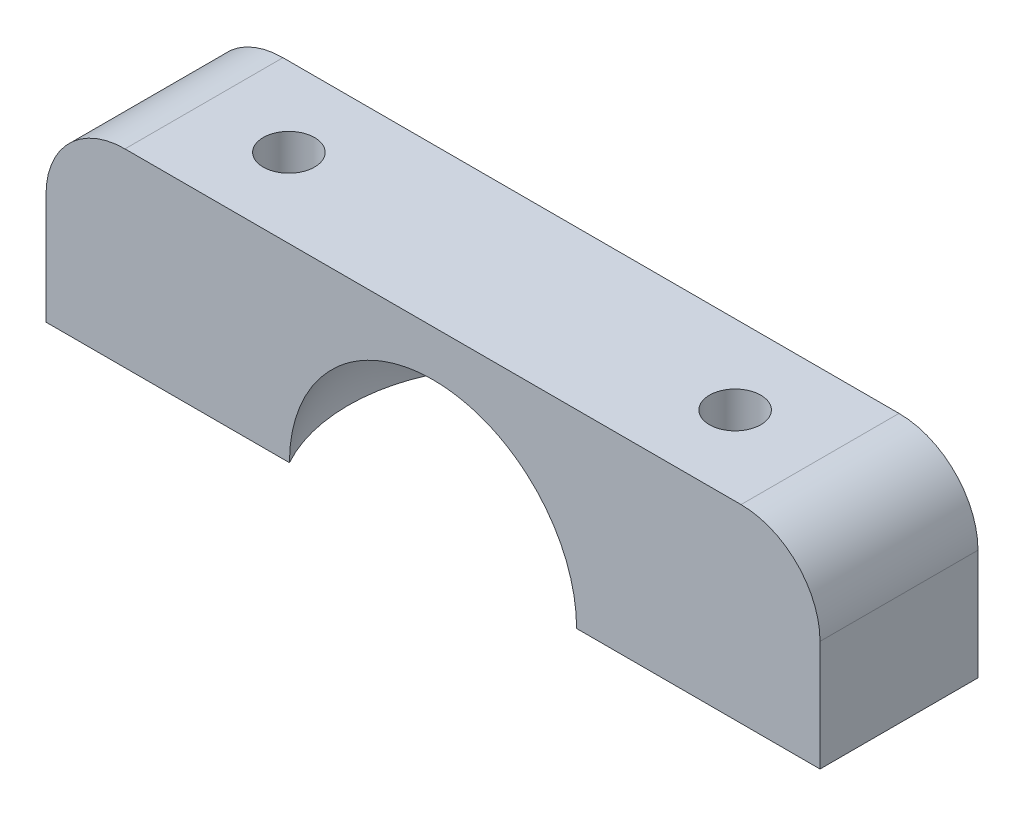
ISO-10303-21;
HEADER;
FILE_DESCRIPTION(('STEP AP214'),'2;1');
FILE_NAME('part.step','',(''),(''),'','','');
FILE_SCHEMA(('AUTOMOTIVE_DESIGN { 1 0 10303 214 1 1 1 1 }'));
ENDSEC;
DATA;
#1=APPLICATION_CONTEXT('core data for automotive mechanical design processes');
#2=APPLICATION_PROTOCOL_DEFINITION('international standard','automotive_design',2000,#1);
#3=PRODUCT_CONTEXT('',#1,'mechanical');
#4=PRODUCT('Part','Part','',(#3));
#5=PRODUCT_RELATED_PRODUCT_CATEGORY('part','',(#4));
#6=PRODUCT_DEFINITION_FORMATION('','',#4);
#7=PRODUCT_DEFINITION_CONTEXT('part definition',#1,'design');
#8=PRODUCT_DEFINITION('design','',#6,#7);
#9=PRODUCT_DEFINITION_SHAPE('','',#8);
#10=(LENGTH_UNIT() NAMED_UNIT(*) SI_UNIT(.MILLI.,.METRE.));
#11=(NAMED_UNIT(*) PLANE_ANGLE_UNIT() SI_UNIT($,.RADIAN.));
#12=(NAMED_UNIT(*) SI_UNIT($,.STERADIAN.) SOLID_ANGLE_UNIT());
#13=UNCERTAINTY_MEASURE_WITH_UNIT(LENGTH_MEASURE(1.E-05),#10,'distance_accuracy_value','');
#14=(GEOMETRIC_REPRESENTATION_CONTEXT(3) GLOBAL_UNCERTAINTY_ASSIGNED_CONTEXT((#13)) GLOBAL_UNIT_ASSIGNED_CONTEXT((#10,
#11,#12)) REPRESENTATION_CONTEXT('',''));
#15=CARTESIAN_POINT('',(0.,0.,0.));
#16=DIRECTION('',(0.,0.,1.));
#17=DIRECTION('',(1.,0.,0.));
#18=AXIS2_PLACEMENT_3D('',#15,#16,#17);
#19=CARTESIAN_POINT('',(-9.8,-4.8,2.));
#20=DIRECTION('',(0.,1.,0.));
#21=DIRECTION('',(-1.,0.,0.));
#22=AXIS2_PLACEMENT_3D('',#19,#20,#21);
#23=PLANE('',#22);
#24=CARTESIAN_POINT('',(5.65,-4.8,0.));
#25=DIRECTION('',(0.,1.,0.));
#26=DIRECTION('',(-1.,0.,0.));
#27=AXIS2_PLACEMENT_3D('',#24,#25,#26);
#28=CIRCLE('',#27,0.650000000000013);
#29=CARTESIAN_POINT('',(4.99999999999999,-4.8,0.));
#30=VERTEX_POINT('',#29);
#31=EDGE_CURVE('E134',#30,#30,#28,.T.);
#32=ORIENTED_EDGE('',*,*,#31,.T.);
#33=EDGE_LOOP('',(#32));
#34=FACE_BOUND('',#33,.T.);
#35=DIRECTION('',(1.,0.,0.));
#36=VECTOR('',#35,1.);
#37=CARTESIAN_POINT('',(-9.8,-4.8,2.));
#38=LINE('',#37,#36);
#39=CARTESIAN_POINT('',(3.63627556711534,-4.8,2.));
#40=VERTEX_POINT('',#39);
#41=CARTESIAN_POINT('',(9.8,-4.8,2.));
#42=VERTEX_POINT('',#41);
#43=EDGE_CURVE('E124',#40,#42,#38,.T.);
#44=ORIENTED_EDGE('',*,*,#43,.F.);
#45=CARTESIAN_POINT('',(0.,-4.8,0.));
#46=DIRECTION('',(0.,1.,0.));
#47=DIRECTION('',(-1.,0.,0.));
#48=AXIS2_PLACEMENT_3D('',#45,#46,#47);
#49=CIRCLE('',#48,4.15);
#50=CARTESIAN_POINT('',(3.63627556711534,-4.8,-2.));
#51=VERTEX_POINT('',#50);
#52=EDGE_CURVE('E108',#40,#51,#49,.T.);
#53=ORIENTED_EDGE('',*,*,#52,.T.);
#54=DIRECTION('',(1.,0.,0.));
#55=VECTOR('',#54,1.);
#56=CARTESIAN_POINT('',(-9.8,-4.8,-2.));
#57=LINE('',#56,#55);
#58=CARTESIAN_POINT('',(9.8,-4.8,-2.));
#59=VERTEX_POINT('',#58);
#60=EDGE_CURVE('E122',#51,#59,#57,.T.);
#61=ORIENTED_EDGE('',*,*,#60,.T.);
#62=DIRECTION('',(0.,0.,-1.));
#63=VECTOR('',#62,1.);
#64=CARTESIAN_POINT('',(9.8,-4.8,2.));
#65=LINE('',#64,#63);
#66=EDGE_CURVE('E142',#42,#59,#65,.T.);
#67=ORIENTED_EDGE('',*,*,#66,.F.);
#68=EDGE_LOOP('',(#44,#53,#61,#67));
#69=FACE_BOUND('',#68,.T.);
#70=ADVANCED_FACE('F39',(#34,#69),#23,.F.);
#71=CARTESIAN_POINT('',(9.8,0.,2.));
#72=DIRECTION('',(0.,-1.,0.));
#73=DIRECTION('',(1.,0.,0.));
#74=AXIS2_PLACEMENT_3D('',#71,#72,#73);
#75=PLANE('',#74);
#76=CARTESIAN_POINT('',(-5.65,0.,0.));
#77=DIRECTION('',(0.,1.,0.));
#78=DIRECTION('',(0.,0.,1.));
#79=AXIS2_PLACEMENT_3D('',#76,#77,#78);
#80=CIRCLE('',#79,0.650000000000013);
#81=CARTESIAN_POINT('',(-5.65,0.,0.650000000000013));
#82=VERTEX_POINT('',#81);
#83=EDGE_CURVE('E191',#82,#82,#80,.T.);
#84=ORIENTED_EDGE('',*,*,#83,.F.);
#85=EDGE_LOOP('',(#84));
#86=FACE_BOUND('',#85,.T.);
#87=DIRECTION('',(-1.,0.,0.));
#88=VECTOR('',#87,1.);
#89=CARTESIAN_POINT('',(9.8,0.,-2.));
#90=LINE('',#89,#88);
#91=CARTESIAN_POINT('',(7.8,0.,-2.));
#92=VERTEX_POINT('',#91);
#93=CARTESIAN_POINT('',(-7.8,0.,-2.));
#94=VERTEX_POINT('',#93);
#95=EDGE_CURVE('E139',#92,#94,#90,.T.);
#96=ORIENTED_EDGE('',*,*,#95,.T.);
#97=DIRECTION('',(0.,0.,-1.));
#98=VECTOR('',#97,1.);
#99=CARTESIAN_POINT('',(-7.8,0.,2.));
#100=LINE('',#99,#98);
#101=CARTESIAN_POINT('',(-7.8,0.,2.));
#102=VERTEX_POINT('',#101);
#103=EDGE_CURVE('E60',#94,#102,#100,.F.);
#104=ORIENTED_EDGE('',*,*,#103,.T.);
#105=DIRECTION('',(-1.,0.,0.));
#106=VECTOR('',#105,1.);
#107=CARTESIAN_POINT('',(-3.46410161513775,0.,2.));
#108=LINE('',#107,#106);
#109=CARTESIAN_POINT('',(7.8,0.,2.));
#110=VERTEX_POINT('',#109);
#111=EDGE_CURVE('E141',#110,#102,#108,.T.);
#112=ORIENTED_EDGE('',*,*,#111,.F.);
#113=DIRECTION('',(0.,0.,-1.));
#114=VECTOR('',#113,1.);
#115=CARTESIAN_POINT('',(7.8,0.,2.));
#116=LINE('',#115,#114);
#117=EDGE_CURVE('E153',#110,#92,#116,.T.);
#118=ORIENTED_EDGE('',*,*,#117,.T.);
#119=EDGE_LOOP('',(#96,#104,#112,#118));
#120=FACE_BOUND('',#119,.T.);
#121=CARTESIAN_POINT('',(5.65,0.,0.));
#122=DIRECTION('',(0.,1.,0.));
#123=DIRECTION('',(0.,0.,1.));
#124=AXIS2_PLACEMENT_3D('',#121,#122,#123);
#125=CIRCLE('',#124,0.650000000000013);
#126=CARTESIAN_POINT('',(5.65,0.,0.650000000000013));
#127=VERTEX_POINT('',#126);
#128=EDGE_CURVE('E185',#127,#127,#125,.T.);
#129=ORIENTED_EDGE('',*,*,#128,.F.);
#130=EDGE_LOOP('',(#129));
#131=FACE_BOUND('',#130,.T.);
#132=ADVANCED_FACE('F173',(#86,#120,#131),#75,.F.);
#133=CARTESIAN_POINT('',(-9.8,0.,2.));
#134=DIRECTION('',(1.,0.,0.));
#135=DIRECTION('',(0.,0.,-1.));
#136=AXIS2_PLACEMENT_3D('',#133,#134,#135);
#137=PLANE('',#136);
#138=DIRECTION('',(0.,-1.,0.));
#139=VECTOR('',#138,1.);
#140=CARTESIAN_POINT('',(-9.8,0.,2.));
#141=LINE('',#140,#139);
#142=CARTESIAN_POINT('',(-9.8,-2.00000000000001,2.));
#143=VERTEX_POINT('',#142);
#144=CARTESIAN_POINT('',(-9.8,-4.8,2.));
#145=VERTEX_POINT('',#144);
#146=EDGE_CURVE('E163',#143,#145,#141,.T.);
#147=ORIENTED_EDGE('',*,*,#146,.F.);
#148=DIRECTION('',(0.,0.,-1.));
#149=VECTOR('',#148,1.);
#150=CARTESIAN_POINT('',(-9.8,-2.00000000000001,2.));
#151=LINE('',#150,#149);
#152=CARTESIAN_POINT('',(-9.8,-2.00000000000001,-2.));
#153=VERTEX_POINT('',#152);
#154=EDGE_CURVE('E116',#143,#153,#151,.T.);
#155=ORIENTED_EDGE('',*,*,#154,.T.);
#156=DIRECTION('',(0.,-1.,0.));
#157=VECTOR('',#156,1.);
#158=CARTESIAN_POINT('',(-9.8,0.,-2.));
#159=LINE('',#158,#157);
#160=CARTESIAN_POINT('',(-9.8,-4.8,-2.));
#161=VERTEX_POINT('',#160);
#162=EDGE_CURVE('E132',#153,#161,#159,.T.);
#163=ORIENTED_EDGE('',*,*,#162,.T.);
#164=DIRECTION('',(0.,0.,-1.));
#165=VECTOR('',#164,1.);
#166=CARTESIAN_POINT('',(-9.8,-4.8,2.));
#167=LINE('',#166,#165);
#168=EDGE_CURVE('E117',#145,#161,#167,.T.);
#169=ORIENTED_EDGE('',*,*,#168,.F.);
#170=EDGE_LOOP('',(#147,#155,#163,#169));
#171=FACE_BOUND('',#170,.T.);
#172=ADVANCED_FACE('F168',(#171),#137,.F.);
#173=CARTESIAN_POINT('',(-5.65,-4.8,0.));
#174=DIRECTION('',(0.,1.,0.));
#175=DIRECTION('',(-1.,0.,0.));
#176=AXIS2_PLACEMENT_3D('',#173,#174,#175);
#177=CIRCLE('',#176,0.650000000000013);
#178=CARTESIAN_POINT('',(-6.30000000000001,-4.8,0.));
#179=VERTEX_POINT('',#178);
#180=EDGE_CURVE('E188',#179,#179,#177,.T.);
#181=ORIENTED_EDGE('',*,*,#180,.T.);
#182=EDGE_LOOP('',(#181));
#183=FACE_BOUND('',#182,.T.);
#184=CARTESIAN_POINT('',(-3.63627556711534,-4.8,-2.));
#185=VERTEX_POINT('',#184);
#186=EDGE_CURVE('E131',#161,#185,#57,.T.);
#187=ORIENTED_EDGE('',*,*,#186,.T.);
#188=CARTESIAN_POINT('',(-3.63627556711534,-4.8,2.));
#189=VERTEX_POINT('',#188);
#190=EDGE_CURVE('E111',#185,#189,#49,.T.);
#191=ORIENTED_EDGE('',*,*,#190,.T.);
#192=EDGE_CURVE('E179',#145,#189,#38,.T.);
#193=ORIENTED_EDGE('',*,*,#192,.F.);
#194=ORIENTED_EDGE('',*,*,#168,.T.);
#195=EDGE_LOOP('',(#187,#191,#193,#194));
#196=FACE_BOUND('',#195,.T.);
#197=ADVANCED_FACE('F195',(#183,#196),#23,.F.);
#198=CARTESIAN_POINT('',(9.8,-4.8,2.));
#199=DIRECTION('',(-1.,0.,0.));
#200=DIRECTION('',(0.,-1.,0.));
#201=AXIS2_PLACEMENT_3D('',#198,#199,#200);
#202=PLANE('',#201);
#203=DIRECTION('',(0.,1.,0.));
#204=VECTOR('',#203,1.);
#205=CARTESIAN_POINT('',(9.8,-4.8,-2.));
#206=LINE('',#205,#204);
#207=CARTESIAN_POINT('',(9.8,-2.,-2.));
#208=VERTEX_POINT('',#207);
#209=EDGE_CURVE('E130',#59,#208,#206,.T.);
#210=ORIENTED_EDGE('',*,*,#209,.T.);
#211=DIRECTION('',(0.,0.,-1.));
#212=VECTOR('',#211,1.);
#213=CARTESIAN_POINT('',(9.8,-2.,2.));
#214=LINE('',#213,#212);
#215=CARTESIAN_POINT('',(9.8,-2.,2.));
#216=VERTEX_POINT('',#215);
#217=EDGE_CURVE('E11',#208,#216,#214,.F.);
#218=ORIENTED_EDGE('',*,*,#217,.T.);
#219=DIRECTION('',(0.,1.,0.));
#220=VECTOR('',#219,1.);
#221=CARTESIAN_POINT('',(9.8,-4.8,2.));
#222=LINE('',#221,#220);
#223=EDGE_CURVE('E144',#42,#216,#222,.T.);
#224=ORIENTED_EDGE('',*,*,#223,.F.);
#225=ORIENTED_EDGE('',*,*,#66,.T.);
#226=EDGE_LOOP('',(#210,#218,#224,#225));
#227=FACE_BOUND('',#226,.T.);
#228=ADVANCED_FACE('F178',(#227),#202,.F.);
#229=CARTESIAN_POINT('',(0.,0.,2.));
#230=DIRECTION('',(0.,0.,1.));
#231=DIRECTION('',(1.,0.,0.));
#232=AXIS2_PLACEMENT_3D('',#229,#230,#231);
#233=PLANE('',#232);
#234=ORIENTED_EDGE('',*,*,#111,.T.);
#235=CARTESIAN_POINT('',(-7.8,-2.00000000000001,2.));
#236=DIRECTION('',(0.,0.,1.));
#237=DIRECTION('',(1.,0.,0.));
#238=AXIS2_PLACEMENT_3D('',#235,#236,#237);
#239=CIRCLE('',#238,2.);
#240=EDGE_CURVE('E47',#102,#143,#239,.T.);
#241=ORIENTED_EDGE('',*,*,#240,.T.);
#242=ORIENTED_EDGE('',*,*,#146,.T.);
#243=ORIENTED_EDGE('',*,*,#192,.T.);
#244=CARTESIAN_POINT('',(0.,-4.80000000000002,2.));
#245=DIRECTION('',(0.,0.,1.));
#246=DIRECTION('',(1.,0.,0.));
#247=AXIS2_PLACEMENT_3D('',#244,#245,#246);
#248=CIRCLE('',#247,3.63627556711534);
#249=EDGE_CURVE('E125',#40,#189,#248,.T.);
#250=ORIENTED_EDGE('',*,*,#249,.F.);
#251=ORIENTED_EDGE('',*,*,#43,.T.);
#252=ORIENTED_EDGE('',*,*,#223,.T.);
#253=CARTESIAN_POINT('',(7.8,-2.,2.));
#254=DIRECTION('',(0.,0.,1.));
#255=DIRECTION('',(1.,0.,0.));
#256=AXIS2_PLACEMENT_3D('',#253,#254,#255);
#257=CIRCLE('',#256,2.);
#258=EDGE_CURVE('E157',#216,#110,#257,.T.);
#259=ORIENTED_EDGE('',*,*,#258,.T.);
#260=EDGE_LOOP('',(#234,#241,#242,#243,#250,#251,#252,#259));
#261=FACE_BOUND('',#260,.T.);
#262=ADVANCED_FACE('F161',(#261),#233,.T.);
#263=CARTESIAN_POINT('',(0.,0.,-2.));
#264=DIRECTION('',(0.,0.,1.));
#265=DIRECTION('',(1.,0.,0.));
#266=AXIS2_PLACEMENT_3D('',#263,#264,#265);
#267=PLANE('',#266);
#268=ORIENTED_EDGE('',*,*,#162,.F.);
#269=CARTESIAN_POINT('',(-7.8,-2.00000000000001,-2.));
#270=DIRECTION('',(0.,0.,1.));
#271=DIRECTION('',(1.,0.,0.));
#272=AXIS2_PLACEMENT_3D('',#269,#270,#271);
#273=CIRCLE('',#272,2.);
#274=EDGE_CURVE('E151',#153,#94,#273,.F.);
#275=ORIENTED_EDGE('',*,*,#274,.T.);
#276=ORIENTED_EDGE('',*,*,#95,.F.);
#277=CARTESIAN_POINT('',(7.8,-2.,-2.));
#278=DIRECTION('',(0.,0.,1.));
#279=DIRECTION('',(1.,0.,0.));
#280=AXIS2_PLACEMENT_3D('',#277,#278,#279);
#281=CIRCLE('',#280,2.);
#282=EDGE_CURVE('E149',#92,#208,#281,.F.);
#283=ORIENTED_EDGE('',*,*,#282,.T.);
#284=ORIENTED_EDGE('',*,*,#209,.F.);
#285=ORIENTED_EDGE('',*,*,#60,.F.);
#286=CARTESIAN_POINT('',(0.,-4.80000000000002,-2.));
#287=DIRECTION('',(0.,0.,1.));
#288=DIRECTION('',(1.,0.,0.));
#289=AXIS2_PLACEMENT_3D('',#286,#287,#288);
#290=CIRCLE('',#289,3.63627556711534);
#291=EDGE_CURVE('E105',#51,#185,#290,.T.);
#292=ORIENTED_EDGE('',*,*,#291,.T.);
#293=ORIENTED_EDGE('',*,*,#186,.F.);
#294=EDGE_LOOP('',(#268,#275,#276,#283,#284,#285,#292,#293));
#295=FACE_BOUND('',#294,.T.);
#296=ADVANCED_FACE('F129',(#295),#267,.F.);
#297=CARTESIAN_POINT('',(5.65,0.,0.));
#298=DIRECTION('',(0.,1.,0.));
#299=DIRECTION('',(0.,0.,1.));
#300=AXIS2_PLACEMENT_3D('',#297,#298,#299);
#301=CYLINDRICAL_SURFACE('',#300,0.650000000000013);
#302=ORIENTED_EDGE('',*,*,#31,.F.);
#303=EDGE_LOOP('',(#302));
#304=FACE_BOUND('',#303,.T.);
#305=ORIENTED_EDGE('',*,*,#128,.T.);
#306=EDGE_LOOP('',(#305));
#307=FACE_BOUND('',#306,.T.);
#308=ADVANCED_FACE('F214',(#304,#307),#301,.F.);
#309=CARTESIAN_POINT('',(-5.65,0.,0.));
#310=DIRECTION('',(0.,1.,0.));
#311=DIRECTION('',(0.,0.,1.));
#312=AXIS2_PLACEMENT_3D('',#309,#310,#311);
#313=CYLINDRICAL_SURFACE('',#312,0.650000000000013);
#314=ORIENTED_EDGE('',*,*,#180,.F.);
#315=EDGE_LOOP('',(#314));
#316=FACE_BOUND('',#315,.T.);
#317=ORIENTED_EDGE('',*,*,#83,.T.);
#318=EDGE_LOOP('',(#317));
#319=FACE_BOUND('',#318,.T.);
#320=ADVANCED_FACE('F217',(#316,#319),#313,.F.);
#321=CARTESIAN_POINT('',(0.,-4.80000000000002,0.));
#322=DIRECTION('',(0.,1.,0.));
#323=DIRECTION('',(-1.,0.,0.));
#324=AXIS2_PLACEMENT_3D('',#321,#322,#323);
#325=SPHERICAL_SURFACE('',#324,4.15);
#326=ORIENTED_EDGE('',*,*,#249,.T.);
#327=ORIENTED_EDGE('',*,*,#190,.F.);
#328=ORIENTED_EDGE('',*,*,#291,.F.);
#329=ORIENTED_EDGE('',*,*,#52,.F.);
#330=EDGE_LOOP('',(#326,#327,#328,#329));
#331=FACE_BOUND('',#330,.T.);
#332=ADVANCED_FACE('F107',(#331),#325,.F.);
#333=CARTESIAN_POINT('',(-7.8,-2.00000000000001,2.));
#334=DIRECTION('',(0.,0.,-1.));
#335=DIRECTION('',(-1.,0.,0.));
#336=AXIS2_PLACEMENT_3D('',#333,#334,#335);
#337=CYLINDRICAL_SURFACE('',#336,2.);
#338=ORIENTED_EDGE('',*,*,#240,.F.);
#339=ORIENTED_EDGE('',*,*,#103,.F.);
#340=ORIENTED_EDGE('',*,*,#274,.F.);
#341=ORIENTED_EDGE('',*,*,#154,.F.);
#342=EDGE_LOOP('',(#338,#339,#340,#341));
#343=FACE_BOUND('',#342,.T.);
#344=ADVANCED_FACE('F171',(#343),#337,.T.);
#345=CARTESIAN_POINT('',(7.8,-2.,2.));
#346=DIRECTION('',(0.,0.,-1.));
#347=DIRECTION('',(-1.,0.,0.));
#348=AXIS2_PLACEMENT_3D('',#345,#346,#347);
#349=CYLINDRICAL_SURFACE('',#348,2.);
#350=ORIENTED_EDGE('',*,*,#258,.F.);
#351=ORIENTED_EDGE('',*,*,#217,.F.);
#352=ORIENTED_EDGE('',*,*,#282,.F.);
#353=ORIENTED_EDGE('',*,*,#117,.F.);
#354=EDGE_LOOP('',(#350,#351,#352,#353));
#355=FACE_BOUND('',#354,.T.);
#356=ADVANCED_FACE('F41',(#355),#349,.T.);
#357=CLOSED_SHELL('',(#70,#132,#172,#197,#228,#262,#296,#308,#320,#332,#344,#356));
#358=MANIFOLD_SOLID_BREP('B2',#357);
#359=ADVANCED_BREP_SHAPE_REPRESENTATION('',(#18,#358),#14);
#360=SHAPE_DEFINITION_REPRESENTATION(#9,#359);
ENDSEC;
END-ISO-10303-21;
